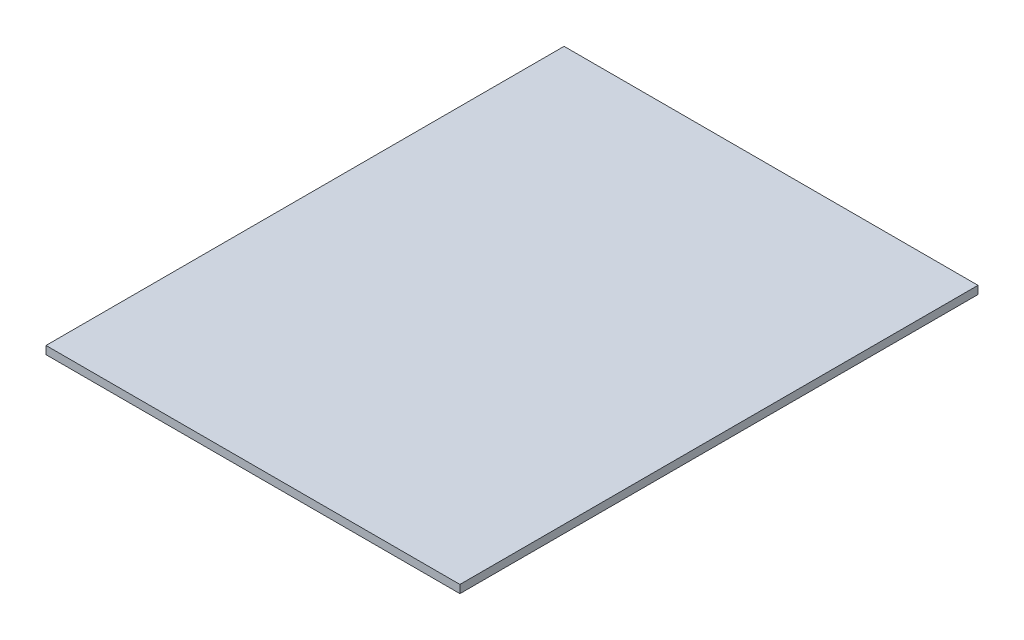
ISO-10303-21;
HEADER;
FILE_DESCRIPTION(('STEP AP214'),'2;1');
FILE_NAME('part.step','',(''),(''),'','','');
FILE_SCHEMA(('AUTOMOTIVE_DESIGN { 1 0 10303 214 1 1 1 1 }'));
ENDSEC;
DATA;
#1=APPLICATION_CONTEXT('core data for automotive mechanical design processes');
#2=APPLICATION_PROTOCOL_DEFINITION('international standard','automotive_design',2000,#1);
#3=PRODUCT_CONTEXT('',#1,'mechanical');
#4=PRODUCT('Part','Part','',(#3));
#5=PRODUCT_RELATED_PRODUCT_CATEGORY('part','',(#4));
#6=PRODUCT_DEFINITION_FORMATION('','',#4);
#7=PRODUCT_DEFINITION_CONTEXT('part definition',#1,'design');
#8=PRODUCT_DEFINITION('design','',#6,#7);
#9=PRODUCT_DEFINITION_SHAPE('','',#8);
#10=(LENGTH_UNIT() NAMED_UNIT(*) SI_UNIT(.MILLI.,.METRE.));
#11=(NAMED_UNIT(*) PLANE_ANGLE_UNIT() SI_UNIT($,.RADIAN.));
#12=(NAMED_UNIT(*) SI_UNIT($,.STERADIAN.) SOLID_ANGLE_UNIT());
#13=UNCERTAINTY_MEASURE_WITH_UNIT(LENGTH_MEASURE(1.E-05),#10,'distance_accuracy_value','');
#14=(GEOMETRIC_REPRESENTATION_CONTEXT(3) GLOBAL_UNCERTAINTY_ASSIGNED_CONTEXT((#13)) GLOBAL_UNIT_ASSIGNED_CONTEXT((#10,
#11,#12)) REPRESENTATION_CONTEXT('',''));
#15=CARTESIAN_POINT('',(0.,0.,0.));
#16=DIRECTION('',(0.,0.,1.));
#17=DIRECTION('',(1.,0.,0.));
#18=AXIS2_PLACEMENT_3D('',#15,#16,#17);
#19=CARTESIAN_POINT('',(-118.434663486897,6.,-112.313769751693));
#20=DIRECTION('',(1.,0.,0.));
#21=DIRECTION('',(0.,0.,-1.));
#22=AXIS2_PLACEMENT_3D('',#19,#20,#21);
#23=PLANE('',#22);
#24=DIRECTION('',(0.,0.,1.));
#25=VECTOR('',#24,1.);
#26=CARTESIAN_POINT('',(-118.434663486897,0.,-112.313769751693));
#27=LINE('',#26,#25);
#28=CARTESIAN_POINT('',(-118.434663486897,0.,-112.313769751693));
#29=VERTEX_POINT('',#28);
#30=CARTESIAN_POINT('',(-118.434663486897,0.,275.686230248307));
#31=VERTEX_POINT('',#30);
#32=EDGE_CURVE('E96',#29,#31,#27,.T.);
#33=ORIENTED_EDGE('',*,*,#32,.T.);
#34=DIRECTION('',(0.,-1.,0.));
#35=VECTOR('',#34,1.);
#36=CARTESIAN_POINT('',(-118.434663486897,6.,275.686230248307));
#37=LINE('',#36,#35);
#38=CARTESIAN_POINT('',(-118.434663486897,6.,275.686230248307));
#39=VERTEX_POINT('',#38);
#40=EDGE_CURVE('E11',#39,#31,#37,.T.);
#41=ORIENTED_EDGE('',*,*,#40,.F.);
#42=DIRECTION('',(0.,0.,1.));
#43=VECTOR('',#42,1.);
#44=CARTESIAN_POINT('',(-118.434663486897,6.,-112.313769751693));
#45=LINE('',#44,#43);
#46=CARTESIAN_POINT('',(-118.434663486897,6.,-112.313769751693));
#47=VERTEX_POINT('',#46);
#48=EDGE_CURVE('E84',#47,#39,#45,.T.);
#49=ORIENTED_EDGE('',*,*,#48,.F.);
#50=DIRECTION('',(0.,-1.,0.));
#51=VECTOR('',#50,1.);
#52=CARTESIAN_POINT('',(-118.434663486897,6.,-112.313769751693));
#53=LINE('',#52,#51);
#54=EDGE_CURVE('E92',#47,#29,#53,.T.);
#55=ORIENTED_EDGE('',*,*,#54,.T.);
#56=EDGE_LOOP('',(#33,#41,#49,#55));
#57=FACE_BOUND('',#56,.T.);
#58=ADVANCED_FACE('F33',(#57),#23,.F.);
#59=CARTESIAN_POINT('',(-118.434663486897,6.,275.686230248307));
#60=DIRECTION('',(0.,0.,-1.));
#61=DIRECTION('',(-1.,0.,0.));
#62=AXIS2_PLACEMENT_3D('',#59,#60,#61);
#63=PLANE('',#62);
#64=DIRECTION('',(1.,0.,0.));
#65=VECTOR('',#64,1.);
#66=CARTESIAN_POINT('',(-118.434663486897,0.,275.686230248307));
#67=LINE('',#66,#65);
#68=CARTESIAN_POINT('',(191.565336513103,0.,275.686230248307));
#69=VERTEX_POINT('',#68);
#70=EDGE_CURVE('E88',#31,#69,#67,.T.);
#71=ORIENTED_EDGE('',*,*,#70,.T.);
#72=DIRECTION('',(0.,-1.,0.));
#73=VECTOR('',#72,1.);
#74=CARTESIAN_POINT('',(191.565336513103,6.,275.686230248307));
#75=LINE('',#74,#73);
#76=CARTESIAN_POINT('',(191.565336513103,6.,275.686230248307));
#77=VERTEX_POINT('',#76);
#78=EDGE_CURVE('E41',#77,#69,#75,.T.);
#79=ORIENTED_EDGE('',*,*,#78,.F.);
#80=DIRECTION('',(1.,0.,0.));
#81=VECTOR('',#80,1.);
#82=CARTESIAN_POINT('',(-118.434663486897,6.,275.686230248307));
#83=LINE('',#82,#81);
#84=EDGE_CURVE('E79',#39,#77,#83,.T.);
#85=ORIENTED_EDGE('',*,*,#84,.F.);
#86=ORIENTED_EDGE('',*,*,#40,.T.);
#87=EDGE_LOOP('',(#71,#79,#85,#86));
#88=FACE_BOUND('',#87,.T.);
#89=ADVANCED_FACE('F87',(#88),#63,.F.);
#90=CARTESIAN_POINT('',(191.565336513103,6.,-112.313769751693));
#91=DIRECTION('',(-1.,0.,0.));
#92=DIRECTION('',(0.,0.,1.));
#93=AXIS2_PLACEMENT_3D('',#90,#91,#92);
#94=PLANE('',#93);
#95=DIRECTION('',(0.,0.,-1.));
#96=VECTOR('',#95,1.);
#97=CARTESIAN_POINT('',(191.565336513103,0.,-112.313769751693));
#98=LINE('',#97,#96);
#99=CARTESIAN_POINT('',(191.565336513103,0.,-112.313769751693));
#100=VERTEX_POINT('',#99);
#101=EDGE_CURVE('E66',#69,#100,#98,.T.);
#102=ORIENTED_EDGE('',*,*,#101,.T.);
#103=DIRECTION('',(0.,-1.,0.));
#104=VECTOR('',#103,1.);
#105=CARTESIAN_POINT('',(191.565336513103,6.,-112.313769751693));
#106=LINE('',#105,#104);
#107=CARTESIAN_POINT('',(191.565336513103,6.,-112.313769751693));
#108=VERTEX_POINT('',#107);
#109=EDGE_CURVE('E89',#108,#100,#106,.T.);
#110=ORIENTED_EDGE('',*,*,#109,.F.);
#111=DIRECTION('',(0.,0.,-1.));
#112=VECTOR('',#111,1.);
#113=CARTESIAN_POINT('',(191.565336513103,6.,-112.313769751693));
#114=LINE('',#113,#112);
#115=EDGE_CURVE('E82',#77,#108,#114,.T.);
#116=ORIENTED_EDGE('',*,*,#115,.F.);
#117=ORIENTED_EDGE('',*,*,#78,.T.);
#118=EDGE_LOOP('',(#102,#110,#116,#117));
#119=FACE_BOUND('',#118,.T.);
#120=ADVANCED_FACE('F90',(#119),#94,.F.);
#121=CARTESIAN_POINT('',(-118.434663486897,6.,-112.313769751693));
#122=DIRECTION('',(0.,0.,1.));
#123=DIRECTION('',(1.,0.,0.));
#124=AXIS2_PLACEMENT_3D('',#121,#122,#123);
#125=PLANE('',#124);
#126=DIRECTION('',(-1.,0.,0.));
#127=VECTOR('',#126,1.);
#128=CARTESIAN_POINT('',(-118.434663486897,0.,-112.313769751693));
#129=LINE('',#128,#127);
#130=EDGE_CURVE('E72',#100,#29,#129,.T.);
#131=ORIENTED_EDGE('',*,*,#130,.T.);
#132=ORIENTED_EDGE('',*,*,#54,.F.);
#133=DIRECTION('',(-1.,0.,0.));
#134=VECTOR('',#133,1.);
#135=CARTESIAN_POINT('',(-118.434663486897,6.,-112.313769751693));
#136=LINE('',#135,#134);
#137=EDGE_CURVE('E49',#108,#47,#136,.T.);
#138=ORIENTED_EDGE('',*,*,#137,.F.);
#139=ORIENTED_EDGE('',*,*,#109,.T.);
#140=EDGE_LOOP('',(#131,#132,#138,#139));
#141=FACE_BOUND('',#140,.T.);
#142=ADVANCED_FACE('F103',(#141),#125,.F.);
#143=CARTESIAN_POINT('',(0.,6.,0.));
#144=DIRECTION('',(0.,1.,0.));
#145=DIRECTION('',(0.,0.,1.));
#146=AXIS2_PLACEMENT_3D('',#143,#144,#145);
#147=PLANE('',#146);
#148=ORIENTED_EDGE('',*,*,#48,.T.);
#149=ORIENTED_EDGE('',*,*,#84,.T.);
#150=ORIENTED_EDGE('',*,*,#115,.T.);
#151=ORIENTED_EDGE('',*,*,#137,.T.);
#152=EDGE_LOOP('',(#148,#149,#150,#151));
#153=FACE_BOUND('',#152,.T.);
#154=ADVANCED_FACE('F80',(#153),#147,.T.);
#155=CARTESIAN_POINT('',(0.,0.,0.));
#156=DIRECTION('',(0.,1.,0.));
#157=DIRECTION('',(0.,0.,1.));
#158=AXIS2_PLACEMENT_3D('',#155,#156,#157);
#159=PLANE('',#158);
#160=ORIENTED_EDGE('',*,*,#32,.F.);
#161=ORIENTED_EDGE('',*,*,#130,.F.);
#162=ORIENTED_EDGE('',*,*,#101,.F.);
#163=ORIENTED_EDGE('',*,*,#70,.F.);
#164=EDGE_LOOP('',(#160,#161,#162,#163));
#165=FACE_BOUND('',#164,.T.);
#166=ADVANCED_FACE('F106',(#165),#159,.F.);
#167=CLOSED_SHELL('',(#58,#89,#120,#142,#154,#166));
#168=MANIFOLD_SOLID_BREP('B2',#167);
#169=ADVANCED_BREP_SHAPE_REPRESENTATION('',(#18,#168),#14);
#170=SHAPE_DEFINITION_REPRESENTATION(#9,#169);
ENDSEC;
END-ISO-10303-21;
